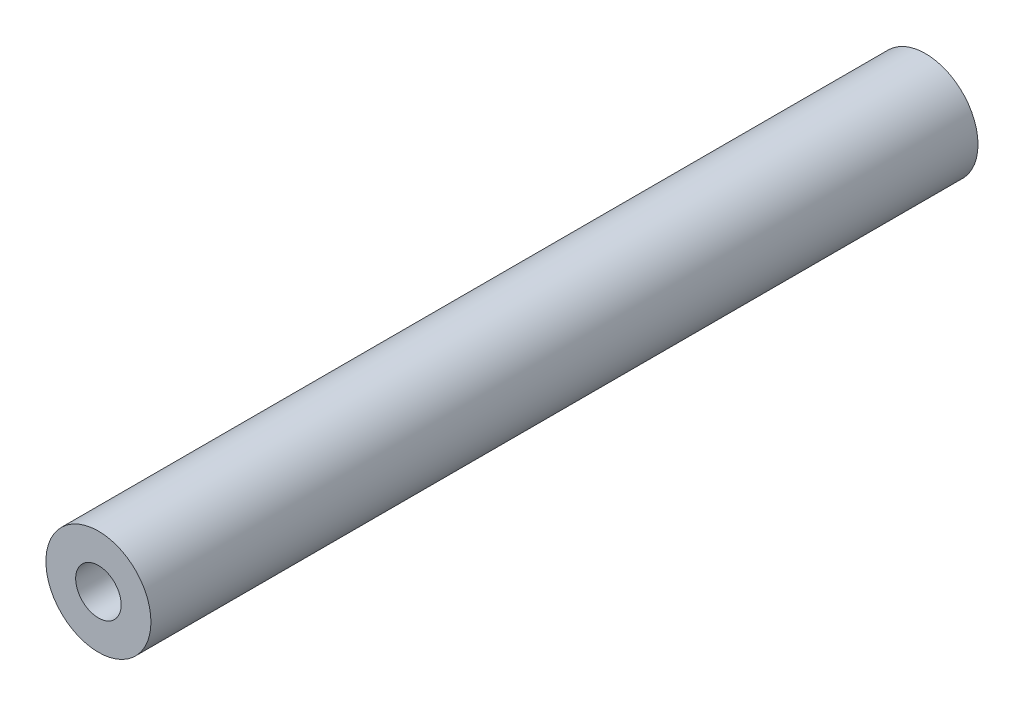
ISO-10303-21;
HEADER;
FILE_DESCRIPTION(('STEP AP214'),'2;1');
FILE_NAME('part.step','',(''),(''),'','','');
FILE_SCHEMA(('AUTOMOTIVE_DESIGN { 1 0 10303 214 1 1 1 1 }'));
ENDSEC;
DATA;
#1=APPLICATION_CONTEXT('core data for automotive mechanical design processes');
#2=APPLICATION_PROTOCOL_DEFINITION('international standard','automotive_design',2000,#1);
#3=PRODUCT_CONTEXT('',#1,'mechanical');
#4=PRODUCT('Part','Part','',(#3));
#5=PRODUCT_RELATED_PRODUCT_CATEGORY('part','',(#4));
#6=PRODUCT_DEFINITION_FORMATION('','',#4);
#7=PRODUCT_DEFINITION_CONTEXT('part definition',#1,'design');
#8=PRODUCT_DEFINITION('design','',#6,#7);
#9=PRODUCT_DEFINITION_SHAPE('','',#8);
#10=(LENGTH_UNIT() NAMED_UNIT(*) SI_UNIT(.MILLI.,.METRE.));
#11=(NAMED_UNIT(*) PLANE_ANGLE_UNIT() SI_UNIT($,.RADIAN.));
#12=(NAMED_UNIT(*) SI_UNIT($,.STERADIAN.) SOLID_ANGLE_UNIT());
#13=UNCERTAINTY_MEASURE_WITH_UNIT(LENGTH_MEASURE(1.E-05),#10,'distance_accuracy_value','');
#14=(GEOMETRIC_REPRESENTATION_CONTEXT(3) GLOBAL_UNCERTAINTY_ASSIGNED_CONTEXT((#13)) GLOBAL_UNIT_ASSIGNED_CONTEXT((#10,
#11,#12)) REPRESENTATION_CONTEXT('',''));
#15=CARTESIAN_POINT('',(0.,0.,0.));
#16=DIRECTION('',(0.,0.,1.));
#17=DIRECTION('',(1.,0.,0.));
#18=AXIS2_PLACEMENT_3D('',#15,#16,#17);
#19=CARTESIAN_POINT('',(0.,0.,25.));
#20=DIRECTION('',(0.,0.,1.));
#21=DIRECTION('',(1.,0.,0.));
#22=AXIS2_PLACEMENT_3D('',#19,#20,#21);
#23=PLANE('',#22);
#24=CARTESIAN_POINT('',(0.,0.,25.));
#25=DIRECTION('',(0.,0.,1.));
#26=DIRECTION('',(1.,0.,0.));
#27=AXIS2_PLACEMENT_3D('',#24,#25,#26);
#28=CIRCLE('',#27,1.5875);
#29=CARTESIAN_POINT('',(1.5875,0.,25.));
#30=VERTEX_POINT('',#29);
#31=EDGE_CURVE('E11',#30,#30,#28,.T.);
#32=ORIENTED_EDGE('',*,*,#31,.T.);
#33=EDGE_LOOP('',(#32));
#34=FACE_BOUND('',#33,.T.);
#35=CARTESIAN_POINT('',(0.,0.,25.));
#36=DIRECTION('',(0.,0.,1.));
#37=DIRECTION('',(1.,0.,0.));
#38=AXIS2_PLACEMENT_3D('',#35,#36,#37);
#39=CIRCLE('',#38,0.6875);
#40=CARTESIAN_POINT('',(0.6875,0.,25.));
#41=VERTEX_POINT('',#40);
#42=EDGE_CURVE('E48',#41,#41,#39,.T.);
#43=ORIENTED_EDGE('',*,*,#42,.F.);
#44=EDGE_LOOP('',(#43));
#45=FACE_BOUND('',#44,.T.);
#46=ADVANCED_FACE('F37',(#34,#45),#23,.T.);
#47=CARTESIAN_POINT('',(0.,0.,0.));
#48=DIRECTION('',(0.,0.,1.));
#49=DIRECTION('',(1.,0.,0.));
#50=AXIS2_PLACEMENT_3D('',#47,#48,#49);
#51=PLANE('',#50);
#52=CARTESIAN_POINT('',(0.,0.,0.));
#53=DIRECTION('',(0.,0.,1.));
#54=DIRECTION('',(1.,0.,0.));
#55=AXIS2_PLACEMENT_3D('',#52,#53,#54);
#56=CIRCLE('',#55,1.5875);
#57=CARTESIAN_POINT('',(1.5875,0.,0.));
#58=VERTEX_POINT('',#57);
#59=EDGE_CURVE('E41',#58,#58,#56,.T.);
#60=ORIENTED_EDGE('',*,*,#59,.F.);
#61=EDGE_LOOP('',(#60));
#62=FACE_BOUND('',#61,.T.);
#63=CARTESIAN_POINT('',(0.,0.,0.));
#64=DIRECTION('',(0.,0.,1.));
#65=DIRECTION('',(1.,0.,0.));
#66=AXIS2_PLACEMENT_3D('',#63,#64,#65);
#67=CIRCLE('',#66,0.6875);
#68=CARTESIAN_POINT('',(0.6875,0.,0.));
#69=VERTEX_POINT('',#68);
#70=EDGE_CURVE('E50',#69,#69,#67,.T.);
#71=ORIENTED_EDGE('',*,*,#70,.T.);
#72=EDGE_LOOP('',(#71));
#73=FACE_BOUND('',#72,.T.);
#74=ADVANCED_FACE('F60',(#62,#73),#51,.F.);
#75=CARTESIAN_POINT('',(0.,0.,25.));
#76=DIRECTION('',(0.,0.,-1.));
#77=DIRECTION('',(-1.,0.,0.));
#78=AXIS2_PLACEMENT_3D('',#75,#76,#77);
#79=CYLINDRICAL_SURFACE('',#78,1.5875);
#80=ORIENTED_EDGE('',*,*,#31,.F.);
#81=EDGE_LOOP('',(#80));
#82=FACE_BOUND('',#81,.T.);
#83=ORIENTED_EDGE('',*,*,#59,.T.);
#84=EDGE_LOOP('',(#83));
#85=FACE_BOUND('',#84,.T.);
#86=ADVANCED_FACE('F39',(#82,#85),#79,.T.);
#87=CARTESIAN_POINT('',(0.,0.,25.));
#88=DIRECTION('',(0.,0.,-1.));
#89=DIRECTION('',(-1.,0.,0.));
#90=AXIS2_PLACEMENT_3D('',#87,#88,#89);
#91=CYLINDRICAL_SURFACE('',#90,0.6875);
#92=ORIENTED_EDGE('',*,*,#42,.T.);
#93=EDGE_LOOP('',(#92));
#94=FACE_BOUND('',#93,.T.);
#95=ORIENTED_EDGE('',*,*,#70,.F.);
#96=EDGE_LOOP('',(#95));
#97=FACE_BOUND('',#96,.T.);
#98=ADVANCED_FACE('F56',(#94,#97),#91,.F.);
#99=CLOSED_SHELL('',(#46,#74,#86,#98));
#100=MANIFOLD_SOLID_BREP('B2',#99);
#101=ADVANCED_BREP_SHAPE_REPRESENTATION('',(#18,#100),#14);
#102=SHAPE_DEFINITION_REPRESENTATION(#9,#101);
ENDSEC;
END-ISO-10303-21;
